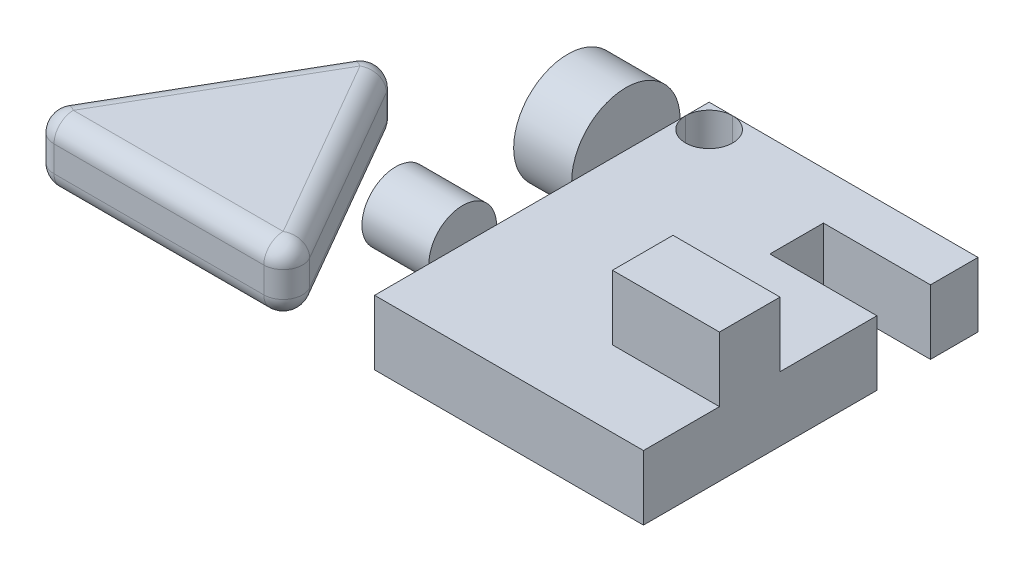
ISO-10303-21;
HEADER;
FILE_DESCRIPTION(('STEP AP214'),'2;1');
FILE_NAME('part.step','',(''),(''),'','','');
FILE_SCHEMA(('AUTOMOTIVE_DESIGN { 1 0 10303 214 1 1 1 1 }'));
ENDSEC;
DATA;
#1=APPLICATION_CONTEXT('core data for automotive mechanical design processes');
#2=APPLICATION_PROTOCOL_DEFINITION('international standard','automotive_design',2000,#1);
#3=PRODUCT_CONTEXT('',#1,'mechanical');
#4=PRODUCT('Part','Part','',(#3));
#5=PRODUCT_RELATED_PRODUCT_CATEGORY('part','',(#4));
#6=PRODUCT_DEFINITION_FORMATION('','',#4);
#7=PRODUCT_DEFINITION_CONTEXT('part definition',#1,'design');
#8=PRODUCT_DEFINITION('design','',#6,#7);
#9=PRODUCT_DEFINITION_SHAPE('','',#8);
#10=(LENGTH_UNIT() NAMED_UNIT(*) SI_UNIT(.MILLI.,.METRE.));
#11=(NAMED_UNIT(*) PLANE_ANGLE_UNIT() SI_UNIT($,.RADIAN.));
#12=(NAMED_UNIT(*) SI_UNIT($,.STERADIAN.) SOLID_ANGLE_UNIT());
#13=UNCERTAINTY_MEASURE_WITH_UNIT(LENGTH_MEASURE(1.E-05),#10,'distance_accuracy_value','');
#14=(GEOMETRIC_REPRESENTATION_CONTEXT(3) GLOBAL_UNCERTAINTY_ASSIGNED_CONTEXT((#13)) GLOBAL_UNIT_ASSIGNED_CONTEXT((#10,
#11,#12)) REPRESENTATION_CONTEXT('',''));
#15=CARTESIAN_POINT('',(0.,0.,0.));
#16=DIRECTION('',(0.,0.,1.));
#17=DIRECTION('',(1.,0.,0.));
#18=AXIS2_PLACEMENT_3D('',#15,#16,#17);
#19=CARTESIAN_POINT('',(0.,10.,0.));
#20=DIRECTION('',(0.,-1.,0.));
#21=DIRECTION('',(0.,0.,-1.));
#22=AXIS2_PLACEMENT_3D('',#19,#20,#21);
#23=PLANE('',#22);
#24=DIRECTION('',(-1.,0.,0.));
#25=VECTOR('',#24,1.);
#26=CARTESIAN_POINT('',(53.2932861145058,10.,-53.2864807231147));
#27=LINE('',#26,#25);
#28=CARTESIAN_POINT('',(94.9045117446962,10.,-53.2864807231147));
#29=VERTEX_POINT('',#28);
#30=CARTESIAN_POINT('',(56.9433094031645,10.,-53.2864807231147));
#31=VERTEX_POINT('',#30);
#32=EDGE_CURVE('E222',#29,#31,#27,.T.);
#33=ORIENTED_EDGE('',*,*,#32,.T.);
#34=CARTESIAN_POINT('',(56.9433094031645,10.,-49.636457434456));
#35=DIRECTION('',(0.,1.,0.));
#36=DIRECTION('',(0.,0.,1.));
#37=AXIS2_PLACEMENT_3D('',#34,#35,#36);
#38=CIRCLE('',#37,3.6500232886587);
#39=CARTESIAN_POINT('',(53.2932861145058,10.,-49.636457434456));
#40=VERTEX_POINT('',#39);
#41=EDGE_CURVE('E56',#40,#31,#38,.T.);
#42=ORIENTED_EDGE('',*,*,#41,.F.);
#43=DIRECTION('',(0.,0.,1.));
#44=VECTOR('',#43,1.);
#45=CARTESIAN_POINT('',(53.2932861145058,10.,-1.51599264809515));
#46=LINE('',#45,#44);
#47=CARTESIAN_POINT('',(53.2932861145058,10.,-48.7900032886893));
#48=VERTEX_POINT('',#47);
#49=EDGE_CURVE('E226',#40,#48,#46,.T.);
#50=ORIENTED_EDGE('',*,*,#49,.T.);
#51=CARTESIAN_POINT('',(53.2932861145058,10.,-32.0196260164736));
#52=VERTEX_POINT('',#51);
#53=EDGE_CURVE('E229',#48,#52,#46,.T.);
#54=ORIENTED_EDGE('',*,*,#53,.T.);
#55=CARTESIAN_POINT('',(53.2932861145058,10.,-20.3790112039944));
#56=VERTEX_POINT('',#55);
#57=EDGE_CURVE('E361',#52,#56,#46,.T.);
#58=ORIENTED_EDGE('',*,*,#57,.T.);
#59=CARTESIAN_POINT('',(53.2932861145058,10.,-9.92218772837755));
#60=VERTEX_POINT('',#59);
#61=EDGE_CURVE('E261',#56,#60,#46,.T.);
#62=ORIENTED_EDGE('',*,*,#61,.T.);
#63=CARTESIAN_POINT('',(53.2932861145058,10.,-1.51599264809515));
#64=VERTEX_POINT('',#63);
#65=EDGE_CURVE('E230',#60,#64,#46,.T.);
#66=ORIENTED_EDGE('',*,*,#65,.T.);
#67=DIRECTION('',(1.,0.,0.));
#68=VECTOR('',#67,1.);
#69=CARTESIAN_POINT('',(53.2932861145058,10.,-1.51599264809515));
#70=LINE('',#69,#68);
#71=CARTESIAN_POINT('',(94.9045117446962,10.,-1.51599264809515));
#72=VERTEX_POINT('',#71);
#73=EDGE_CURVE('E255',#64,#72,#70,.T.);
#74=ORIENTED_EDGE('',*,*,#73,.T.);
#75=DIRECTION('',(0.,0.,-1.));
#76=VECTOR('',#75,1.);
#77=CARTESIAN_POINT('',(94.9045117446962,10.,-1.51599264809515));
#78=LINE('',#77,#76);
#79=CARTESIAN_POINT('',(94.9045117446962,10.,-13.2762631828207));
#80=VERTEX_POINT('',#79);
#81=EDGE_CURVE('E246',#72,#80,#78,.T.);
#82=ORIENTED_EDGE('',*,*,#81,.T.);
#83=DIRECTION('',(1.,0.,0.));
#84=VECTOR('',#83,1.);
#85=CARTESIAN_POINT('',(0.,10.,-13.2762631828207));
#86=LINE('',#85,#84);
#87=CARTESIAN_POINT('',(78.3424140614023,10.,-13.2762631828207));
#88=VERTEX_POINT('',#87);
#89=EDGE_CURVE('E187',#88,#80,#86,.T.);
#90=ORIENTED_EDGE('',*,*,#89,.F.);
#91=DIRECTION('',(0.,0.,1.));
#92=VECTOR('',#91,1.);
#93=CARTESIAN_POINT('',(78.3424140614023,10.,0.));
#94=LINE('',#93,#92);
#95=CARTESIAN_POINT('',(78.3424140614023,10.,-22.6479445996471));
#96=VERTEX_POINT('',#95);
#97=EDGE_CURVE('E184',#96,#88,#94,.T.);
#98=ORIENTED_EDGE('',*,*,#97,.F.);
#99=DIRECTION('',(-1.,0.,0.));
#100=VECTOR('',#99,1.);
#101=CARTESIAN_POINT('',(0.,10.,-22.6479445996471));
#102=LINE('',#101,#100);
#103=CARTESIAN_POINT('',(94.9045117446962,10.,-22.6479445996471));
#104=VERTEX_POINT('',#103);
#105=EDGE_CURVE('E186',#104,#96,#102,.T.);
#106=ORIENTED_EDGE('',*,*,#105,.F.);
#107=CARTESIAN_POINT('',(94.9045117446962,10.,-37.6426348665694));
#108=VERTEX_POINT('',#107);
#109=EDGE_CURVE('E244',#104,#108,#78,.T.);
#110=ORIENTED_EDGE('',*,*,#109,.T.);
#111=DIRECTION('',(1.,0.,0.));
#112=VECTOR('',#111,1.);
#113=CARTESIAN_POINT('',(0.,10.,-37.6426348665694));
#114=LINE('',#113,#112);
#115=CARTESIAN_POINT('',(78.3424140614023,10.,-37.6426348665694));
#116=VERTEX_POINT('',#115);
#117=EDGE_CURVE('E284',#116,#108,#114,.T.);
#118=ORIENTED_EDGE('',*,*,#117,.F.);
#119=DIRECTION('',(0.,0.,1.));
#120=VECTOR('',#119,1.);
#121=CARTESIAN_POINT('',(78.3424140614023,10.,0.));
#122=LINE('',#121,#120);
#123=CARTESIAN_POINT('',(78.3424140614023,10.,-45.9291742246054));
#124=VERTEX_POINT('',#123);
#125=EDGE_CURVE('E281',#124,#116,#122,.T.);
#126=ORIENTED_EDGE('',*,*,#125,.F.);
#127=DIRECTION('',(-1.,0.,0.));
#128=VECTOR('',#127,1.);
#129=CARTESIAN_POINT('',(0.,10.,-45.9291742246054));
#130=LINE('',#129,#128);
#131=CARTESIAN_POINT('',(94.9045117446962,10.,-45.9291742246054));
#132=VERTEX_POINT('',#131);
#133=EDGE_CURVE('E292',#132,#124,#130,.T.);
#134=ORIENTED_EDGE('',*,*,#133,.F.);
#135=EDGE_CURVE('E235',#132,#29,#78,.T.);
#136=ORIENTED_EDGE('',*,*,#135,.T.);
#137=EDGE_LOOP('',(#33,#42,#50,#54,#58,#62,#66,#74,#82,#90,#98,#106,#110,#118,#126,#134,#136));
#138=FACE_BOUND('',#137,.T.);
#139=ADVANCED_FACE('F52',(#138),#23,.F.);
#140=CARTESIAN_POINT('',(53.2932861145058,10.,-1.51599264809515));
#141=DIRECTION('',(1.,0.,0.));
#142=DIRECTION('',(0.,0.,-1.));
#143=AXIS2_PLACEMENT_3D('',#140,#141,#142);
#144=PLANE('',#143);
#145=DIRECTION('',(0.,1.,0.));
#146=VECTOR('',#145,1.);
#147=CARTESIAN_POINT('',(53.2932861145058,0.,-49.636457434456));
#148=LINE('',#147,#146);
#149=CARTESIAN_POINT('',(53.2932861145058,0.,-49.636457434456));
#150=VERTEX_POINT('',#149);
#151=EDGE_CURVE('E213',#150,#40,#148,.T.);
#152=ORIENTED_EDGE('',*,*,#151,.F.);
#153=DIRECTION('',(0.,0.,1.));
#154=VECTOR('',#153,1.);
#155=CARTESIAN_POINT('',(53.2932861145058,0.,-1.51599264809515));
#156=LINE('',#155,#154);
#157=CARTESIAN_POINT('',(53.2932861145058,0.,-1.51599264809515));
#158=VERTEX_POINT('',#157);
#159=EDGE_CURVE('E232',#150,#158,#156,.T.);
#160=ORIENTED_EDGE('',*,*,#159,.T.);
#161=DIRECTION('',(0.,-1.,0.));
#162=VECTOR('',#161,1.);
#163=CARTESIAN_POINT('',(53.2932861145058,10.,-1.51599264809515));
#164=LINE('',#163,#162);
#165=EDGE_CURVE('E332',#64,#158,#164,.T.);
#166=ORIENTED_EDGE('',*,*,#165,.F.);
#167=ORIENTED_EDGE('',*,*,#65,.F.);
#168=CARTESIAN_POINT('',(53.2932861145058,10.,-15.150599466186));
#169=DIRECTION('',(-1.,0.,0.));
#170=DIRECTION('',(0.,0.,1.));
#171=AXIS2_PLACEMENT_3D('',#168,#169,#170);
#172=CIRCLE('',#171,5.22841173780843);
#173=EDGE_CURVE('E276',#56,#60,#172,.T.);
#174=ORIENTED_EDGE('',*,*,#173,.F.);
#175=ORIENTED_EDGE('',*,*,#57,.F.);
#176=CARTESIAN_POINT('',(53.2932861145058,10.,-40.4048146525814));
#177=DIRECTION('',(-1.,0.,0.));
#178=DIRECTION('',(0.,0.,1.));
#179=AXIS2_PLACEMENT_3D('',#176,#177,#178);
#180=CIRCLE('',#179,8.38518863610786);
#181=EDGE_CURVE('E267',#48,#52,#180,.T.);
#182=ORIENTED_EDGE('',*,*,#181,.F.);
#183=ORIENTED_EDGE('',*,*,#49,.F.);
#184=EDGE_LOOP('',(#152,#160,#166,#167,#174,#175,#182,#183));
#185=FACE_BOUND('',#184,.T.);
#186=ADVANCED_FACE('F360',(#185),#144,.F.);
#187=CARTESIAN_POINT('',(0.,0.,0.));
#188=DIRECTION('',(0.,-1.,0.));
#189=DIRECTION('',(0.,0.,-1.));
#190=AXIS2_PLACEMENT_3D('',#187,#188,#189);
#191=PLANE('',#190);
#192=CARTESIAN_POINT('',(56.9433094031645,0.,-49.636457434456));
#193=DIRECTION('',(0.,-1.,0.));
#194=DIRECTION('',(0.,0.,-1.));
#195=AXIS2_PLACEMENT_3D('',#192,#193,#194);
#196=CIRCLE('',#195,3.6500232886587);
#197=CARTESIAN_POINT('',(56.9433094031645,0.,-53.2864807231147));
#198=VERTEX_POINT('',#197);
#199=EDGE_CURVE('E12',#198,#150,#196,.T.);
#200=ORIENTED_EDGE('',*,*,#199,.F.);
#201=DIRECTION('',(-1.,0.,0.));
#202=VECTOR('',#201,1.);
#203=CARTESIAN_POINT('',(53.2932861145058,0.,-53.2864807231147));
#204=LINE('',#203,#202);
#205=CARTESIAN_POINT('',(94.9045117446962,0.,-53.2864807231147));
#206=VERTEX_POINT('',#205);
#207=EDGE_CURVE('E219',#206,#198,#204,.T.);
#208=ORIENTED_EDGE('',*,*,#207,.F.);
#209=DIRECTION('',(0.,0.,-1.));
#210=VECTOR('',#209,1.);
#211=CARTESIAN_POINT('',(94.9045117446962,0.,-1.51599264809515));
#212=LINE('',#211,#210);
#213=CARTESIAN_POINT('',(94.9045117446962,0.,-45.9291742246054));
#214=VERTEX_POINT('',#213);
#215=EDGE_CURVE('E307',#214,#206,#212,.T.);
#216=ORIENTED_EDGE('',*,*,#215,.F.);
#217=DIRECTION('',(-1.,0.,0.));
#218=VECTOR('',#217,1.);
#219=CARTESIAN_POINT('',(0.,0.,-45.9291742246054));
#220=LINE('',#219,#218);
#221=CARTESIAN_POINT('',(78.3424140614023,0.,-45.9291742246054));
#222=VERTEX_POINT('',#221);
#223=EDGE_CURVE('E234',#214,#222,#220,.T.);
#224=ORIENTED_EDGE('',*,*,#223,.T.);
#225=DIRECTION('',(0.,0.,1.));
#226=VECTOR('',#225,1.);
#227=CARTESIAN_POINT('',(78.3424140614023,0.,0.));
#228=LINE('',#227,#226);
#229=CARTESIAN_POINT('',(78.3424140614023,0.,-37.6426348665694));
#230=VERTEX_POINT('',#229);
#231=EDGE_CURVE('E197',#222,#230,#228,.T.);
#232=ORIENTED_EDGE('',*,*,#231,.T.);
#233=DIRECTION('',(1.,0.,0.));
#234=VECTOR('',#233,1.);
#235=CARTESIAN_POINT('',(0.,0.,-37.6426348665694));
#236=LINE('',#235,#234);
#237=CARTESIAN_POINT('',(94.9045117446962,0.,-37.6426348665694));
#238=VERTEX_POINT('',#237);
#239=EDGE_CURVE('E304',#230,#238,#236,.T.);
#240=ORIENTED_EDGE('',*,*,#239,.T.);
#241=CARTESIAN_POINT('',(94.9045117446962,0.,-1.51599264809515));
#242=VERTEX_POINT('',#241);
#243=EDGE_CURVE('E288',#242,#238,#212,.T.);
#244=ORIENTED_EDGE('',*,*,#243,.F.);
#245=DIRECTION('',(1.,0.,0.));
#246=VECTOR('',#245,1.);
#247=CARTESIAN_POINT('',(53.2932861145058,0.,-1.51599264809515));
#248=LINE('',#247,#246);
#249=EDGE_CURVE('E315',#158,#242,#248,.T.);
#250=ORIENTED_EDGE('',*,*,#249,.F.);
#251=ORIENTED_EDGE('',*,*,#159,.F.);
#252=EDGE_LOOP('',(#200,#208,#216,#224,#232,#240,#244,#250,#251));
#253=FACE_BOUND('',#252,.T.);
#254=ADVANCED_FACE('F318',(#253),#191,.T.);
#255=CARTESIAN_POINT('',(94.9045117446962,10.,-1.51599264809515));
#256=DIRECTION('',(-1.,0.,0.));
#257=DIRECTION('',(0.,0.,1.));
#258=AXIS2_PLACEMENT_3D('',#255,#256,#257);
#259=PLANE('',#258);
#260=ORIENTED_EDGE('',*,*,#135,.F.);
#261=DIRECTION('',(0.,1.,0.));
#262=VECTOR('',#261,1.);
#263=CARTESIAN_POINT('',(94.9045117446962,0.,-45.9291742246054));
#264=LINE('',#263,#262);
#265=EDGE_CURVE('E289',#214,#132,#264,.T.);
#266=ORIENTED_EDGE('',*,*,#265,.F.);
#267=ORIENTED_EDGE('',*,*,#215,.T.);
#268=DIRECTION('',(0.,-1.,0.));
#269=VECTOR('',#268,1.);
#270=CARTESIAN_POINT('',(94.9045117446962,10.,-53.2864807231147));
#271=LINE('',#270,#269);
#272=EDGE_CURVE('E218',#29,#206,#271,.T.);
#273=ORIENTED_EDGE('',*,*,#272,.F.);
#274=EDGE_LOOP('',(#260,#266,#267,#273));
#275=FACE_BOUND('',#274,.T.);
#276=ADVANCED_FACE('F394',(#275),#259,.F.);
#277=CARTESIAN_POINT('',(53.2932861145058,10.,-1.51599264809515));
#278=DIRECTION('',(0.,0.,-1.));
#279=DIRECTION('',(-1.,0.,0.));
#280=AXIS2_PLACEMENT_3D('',#277,#278,#279);
#281=PLANE('',#280);
#282=ORIENTED_EDGE('',*,*,#249,.T.);
#283=DIRECTION('',(0.,-1.,0.));
#284=VECTOR('',#283,1.);
#285=CARTESIAN_POINT('',(94.9045117446962,10.,-1.51599264809515));
#286=LINE('',#285,#284);
#287=EDGE_CURVE('E201',#72,#242,#286,.T.);
#288=ORIENTED_EDGE('',*,*,#287,.F.);
#289=ORIENTED_EDGE('',*,*,#73,.F.);
#290=ORIENTED_EDGE('',*,*,#165,.T.);
#291=EDGE_LOOP('',(#282,#288,#289,#290));
#292=FACE_BOUND('',#291,.T.);
#293=ADVANCED_FACE('F340',(#292),#281,.F.);
#294=ORIENTED_EDGE('',*,*,#243,.T.);
#295=DIRECTION('',(0.,1.,0.));
#296=VECTOR('',#295,1.);
#297=CARTESIAN_POINT('',(94.9045117446962,0.,-37.6426348665694));
#298=LINE('',#297,#296);
#299=EDGE_CURVE('E202',#238,#108,#298,.T.);
#300=ORIENTED_EDGE('',*,*,#299,.T.);
#301=ORIENTED_EDGE('',*,*,#109,.F.);
#302=DIRECTION('',(0.,-1.,0.));
#303=VECTOR('',#302,1.);
#304=CARTESIAN_POINT('',(94.9045117446962,20.,-22.6479445996471));
#305=LINE('',#304,#303);
#306=CARTESIAN_POINT('',(94.9045117446962,20.,-22.6479445996471));
#307=VERTEX_POINT('',#306);
#308=EDGE_CURVE('E181',#307,#104,#305,.T.);
#309=ORIENTED_EDGE('',*,*,#308,.F.);
#310=DIRECTION('',(0.,0.,-1.));
#311=VECTOR('',#310,1.);
#312=CARTESIAN_POINT('',(94.9045117446962,20.,0.));
#313=LINE('',#312,#311);
#314=CARTESIAN_POINT('',(94.9045117446962,20.,-13.2762631828207));
#315=VERTEX_POINT('',#314);
#316=EDGE_CURVE('E170',#315,#307,#313,.T.);
#317=ORIENTED_EDGE('',*,*,#316,.F.);
#318=DIRECTION('',(0.,-1.,0.));
#319=VECTOR('',#318,1.);
#320=CARTESIAN_POINT('',(94.9045117446962,20.,-13.2762631828207));
#321=LINE('',#320,#319);
#322=EDGE_CURVE('E166',#315,#80,#321,.T.);
#323=ORIENTED_EDGE('',*,*,#322,.T.);
#324=ORIENTED_EDGE('',*,*,#81,.F.);
#325=ORIENTED_EDGE('',*,*,#287,.T.);
#326=EDGE_LOOP('',(#294,#300,#301,#309,#317,#323,#324,#325));
#327=FACE_BOUND('',#326,.T.);
#328=ADVANCED_FACE('F328',(#327),#259,.F.);
#329=CARTESIAN_POINT('',(53.2932861145058,10.,-53.2864807231147));
#330=DIRECTION('',(0.,0.,1.));
#331=DIRECTION('',(1.,0.,0.));
#332=AXIS2_PLACEMENT_3D('',#329,#330,#331);
#333=PLANE('',#332);
#334=ORIENTED_EDGE('',*,*,#207,.T.);
#335=DIRECTION('',(0.,1.,0.));
#336=VECTOR('',#335,1.);
#337=CARTESIAN_POINT('',(56.9433094031645,0.,-53.2864807231147));
#338=LINE('',#337,#336);
#339=EDGE_CURVE('E73',#198,#31,#338,.T.);
#340=ORIENTED_EDGE('',*,*,#339,.T.);
#341=ORIENTED_EDGE('',*,*,#32,.F.);
#342=ORIENTED_EDGE('',*,*,#272,.T.);
#343=EDGE_LOOP('',(#334,#340,#341,#342));
#344=FACE_BOUND('',#343,.T.);
#345=ADVANCED_FACE('F344',(#344),#333,.F.);
#346=CARTESIAN_POINT('',(53.2932861145058,10.,-48.7900032886893));
#347=DIRECTION('',(-1.,0.,0.));
#348=DIRECTION('',(0.,0.,1.));
#349=AXIS2_PLACEMENT_3D('',#346,#347,#348);
#350=PLANE('',#349);
#351=ORIENTED_EDGE('',*,*,#53,.F.);
#352=EDGE_CURVE('E263',#52,#48,#180,.T.);
#353=ORIENTED_EDGE('',*,*,#352,.F.);
#354=EDGE_LOOP('',(#351,#353));
#355=FACE_BOUND('',#354,.T.);
#356=ADVANCED_FACE('F374',(#355),#350,.F.);
#357=CARTESIAN_POINT('',(44.3084131266116,10.,-40.4048146525814));
#358=DIRECTION('',(-1.,0.,0.));
#359=DIRECTION('',(0.,0.,1.));
#360=AXIS2_PLACEMENT_3D('',#357,#358,#359);
#361=CYLINDRICAL_SURFACE('',#360,8.38518863610786);
#362=CARTESIAN_POINT('',(44.3084131266116,10.,-40.4048146525814));
#363=DIRECTION('',(-1.,0.,0.));
#364=DIRECTION('',(0.,0.,1.));
#365=AXIS2_PLACEMENT_3D('',#362,#363,#364);
#366=CIRCLE('',#365,8.38518863610786);
#367=CARTESIAN_POINT('',(44.3084131266116,10.,-32.0196260164736));
#368=VERTEX_POINT('',#367);
#369=EDGE_CURVE('E268',#368,#368,#366,.T.);
#370=ORIENTED_EDGE('',*,*,#369,.F.);
#371=EDGE_LOOP('',(#370));
#372=FACE_BOUND('',#371,.T.);
#373=ORIENTED_EDGE('',*,*,#352,.T.);
#374=ORIENTED_EDGE('',*,*,#181,.T.);
#375=EDGE_LOOP('',(#373,#374));
#376=FACE_BOUND('',#375,.T.);
#377=ADVANCED_FACE('F373',(#372,#376),#361,.T.);
#378=CARTESIAN_POINT('',(44.3084131266116,10.,-48.7900032886893));
#379=DIRECTION('',(1.,0.,0.));
#380=DIRECTION('',(0.,0.,-1.));
#381=AXIS2_PLACEMENT_3D('',#378,#379,#380);
#382=PLANE('',#381);
#383=ORIENTED_EDGE('',*,*,#369,.T.);
#384=EDGE_LOOP('',(#383));
#385=FACE_BOUND('',#384,.T.);
#386=ADVANCED_FACE('F381',(#385),#382,.F.);
#387=CARTESIAN_POINT('',(53.2932861145058,10.,-15.150599466186));
#388=DIRECTION('',(-1.,0.,0.));
#389=DIRECTION('',(0.,0.,1.));
#390=AXIS2_PLACEMENT_3D('',#387,#388,#389);
#391=PLANE('',#390);
#392=EDGE_CURVE('E272',#60,#56,#172,.T.);
#393=ORIENTED_EDGE('',*,*,#392,.F.);
#394=ORIENTED_EDGE('',*,*,#61,.F.);
#395=EDGE_LOOP('',(#393,#394));
#396=FACE_BOUND('',#395,.T.);
#397=ADVANCED_FACE('F419',(#396),#391,.F.);
#398=CARTESIAN_POINT('',(42.9273232336056,10.,-15.150599466186));
#399=DIRECTION('',(-1.,0.,0.));
#400=DIRECTION('',(0.,0.,1.));
#401=AXIS2_PLACEMENT_3D('',#398,#399,#400);
#402=CYLINDRICAL_SURFACE('',#401,5.22841173780843);
#403=CARTESIAN_POINT('',(42.9273232336056,10.,-15.150599466186));
#404=DIRECTION('',(-1.,0.,0.));
#405=DIRECTION('',(0.,0.,1.));
#406=AXIS2_PLACEMENT_3D('',#403,#404,#405);
#407=CIRCLE('',#406,5.22841173780843);
#408=CARTESIAN_POINT('',(42.9273232336056,10.,-9.92218772837755));
#409=VERTEX_POINT('',#408);
#410=EDGE_CURVE('E277',#409,#409,#407,.T.);
#411=ORIENTED_EDGE('',*,*,#410,.F.);
#412=EDGE_LOOP('',(#411));
#413=FACE_BOUND('',#412,.T.);
#414=ORIENTED_EDGE('',*,*,#392,.T.);
#415=ORIENTED_EDGE('',*,*,#173,.T.);
#416=EDGE_LOOP('',(#414,#415));
#417=FACE_BOUND('',#416,.T.);
#418=ADVANCED_FACE('F356',(#413,#417),#402,.T.);
#419=CARTESIAN_POINT('',(42.9273232336056,10.,-20.3790112039944));
#420=DIRECTION('',(1.,0.,0.));
#421=DIRECTION('',(0.,0.,-1.));
#422=AXIS2_PLACEMENT_3D('',#419,#420,#421);
#423=PLANE('',#422);
#424=ORIENTED_EDGE('',*,*,#410,.T.);
#425=EDGE_LOOP('',(#424));
#426=FACE_BOUND('',#425,.T.);
#427=ADVANCED_FACE('F413',(#426),#423,.F.);
#428=CARTESIAN_POINT('',(78.3424140614023,0.,0.));
#429=DIRECTION('',(-1.,0.,0.));
#430=DIRECTION('',(0.,0.,1.));
#431=AXIS2_PLACEMENT_3D('',#428,#429,#430);
#432=PLANE('',#431);
#433=ORIENTED_EDGE('',*,*,#125,.T.);
#434=DIRECTION('',(0.,1.,0.));
#435=VECTOR('',#434,1.);
#436=CARTESIAN_POINT('',(78.3424140614023,0.,-37.6426348665694));
#437=LINE('',#436,#435);
#438=EDGE_CURVE('E210',#230,#116,#437,.T.);
#439=ORIENTED_EDGE('',*,*,#438,.F.);
#440=ORIENTED_EDGE('',*,*,#231,.F.);
#441=DIRECTION('',(0.,1.,0.));
#442=VECTOR('',#441,1.);
#443=CARTESIAN_POINT('',(78.3424140614023,0.,-45.9291742246054));
#444=LINE('',#443,#442);
#445=EDGE_CURVE('E293',#222,#124,#444,.T.);
#446=ORIENTED_EDGE('',*,*,#445,.T.);
#447=EDGE_LOOP('',(#433,#439,#440,#446));
#448=FACE_BOUND('',#447,.T.);
#449=ADVANCED_FACE('F321',(#448),#432,.F.);
#450=CARTESIAN_POINT('',(0.,0.,-45.9291742246054));
#451=DIRECTION('',(0.,0.,-1.));
#452=DIRECTION('',(-1.,0.,0.));
#453=AXIS2_PLACEMENT_3D('',#450,#451,#452);
#454=PLANE('',#453);
#455=ORIENTED_EDGE('',*,*,#133,.T.);
#456=ORIENTED_EDGE('',*,*,#445,.F.);
#457=ORIENTED_EDGE('',*,*,#223,.F.);
#458=ORIENTED_EDGE('',*,*,#265,.T.);
#459=EDGE_LOOP('',(#455,#456,#457,#458));
#460=FACE_BOUND('',#459,.T.);
#461=ADVANCED_FACE('F405',(#460),#454,.F.);
#462=CARTESIAN_POINT('',(0.,0.,-37.6426348665694));
#463=DIRECTION('',(0.,0.,1.));
#464=DIRECTION('',(1.,0.,0.));
#465=AXIS2_PLACEMENT_3D('',#462,#463,#464);
#466=PLANE('',#465);
#467=ORIENTED_EDGE('',*,*,#117,.T.);
#468=ORIENTED_EDGE('',*,*,#299,.F.);
#469=ORIENTED_EDGE('',*,*,#239,.F.);
#470=ORIENTED_EDGE('',*,*,#438,.T.);
#471=EDGE_LOOP('',(#467,#468,#469,#470));
#472=FACE_BOUND('',#471,.T.);
#473=ADVANCED_FACE('F325',(#472),#466,.F.);
#474=CARTESIAN_POINT('',(78.3424140614023,20.,0.));
#475=DIRECTION('',(1.,0.,0.));
#476=DIRECTION('',(0.,0.,-1.));
#477=AXIS2_PLACEMENT_3D('',#474,#475,#476);
#478=PLANE('',#477);
#479=ORIENTED_EDGE('',*,*,#97,.T.);
#480=DIRECTION('',(0.,-1.,0.));
#481=VECTOR('',#480,1.);
#482=CARTESIAN_POINT('',(78.3424140614023,20.,-13.2762631828207));
#483=LINE('',#482,#481);
#484=CARTESIAN_POINT('',(78.3424140614023,20.,-13.2762631828207));
#485=VERTEX_POINT('',#484);
#486=EDGE_CURVE('E163',#485,#88,#483,.T.);
#487=ORIENTED_EDGE('',*,*,#486,.F.);
#488=DIRECTION('',(0.,0.,1.));
#489=VECTOR('',#488,1.);
#490=CARTESIAN_POINT('',(78.3424140614023,20.,0.));
#491=LINE('',#490,#489);
#492=CARTESIAN_POINT('',(78.3424140614023,20.,-22.6479445996471));
#493=VERTEX_POINT('',#492);
#494=EDGE_CURVE('E171',#493,#485,#491,.T.);
#495=ORIENTED_EDGE('',*,*,#494,.F.);
#496=DIRECTION('',(0.,-1.,0.));
#497=VECTOR('',#496,1.);
#498=CARTESIAN_POINT('',(78.3424140614023,20.,-22.6479445996471));
#499=LINE('',#498,#497);
#500=EDGE_CURVE('E193',#493,#96,#499,.T.);
#501=ORIENTED_EDGE('',*,*,#500,.T.);
#502=EDGE_LOOP('',(#479,#487,#495,#501));
#503=FACE_BOUND('',#502,.T.);
#504=ADVANCED_FACE('F183',(#503),#478,.F.);
#505=CARTESIAN_POINT('',(0.,20.,-13.2762631828207));
#506=DIRECTION('',(0.,0.,-1.));
#507=DIRECTION('',(-1.,0.,0.));
#508=AXIS2_PLACEMENT_3D('',#505,#506,#507);
#509=PLANE('',#508);
#510=ORIENTED_EDGE('',*,*,#89,.T.);
#511=ORIENTED_EDGE('',*,*,#322,.F.);
#512=DIRECTION('',(1.,0.,0.));
#513=VECTOR('',#512,1.);
#514=CARTESIAN_POINT('',(0.,20.,-13.2762631828207));
#515=LINE('',#514,#513);
#516=EDGE_CURVE('E158',#485,#315,#515,.T.);
#517=ORIENTED_EDGE('',*,*,#516,.F.);
#518=ORIENTED_EDGE('',*,*,#486,.T.);
#519=EDGE_LOOP('',(#510,#511,#517,#518));
#520=FACE_BOUND('',#519,.T.);
#521=ADVANCED_FACE('F161',(#520),#509,.F.);
#522=CARTESIAN_POINT('',(0.,20.,-22.6479445996471));
#523=DIRECTION('',(0.,0.,1.));
#524=DIRECTION('',(1.,0.,0.));
#525=AXIS2_PLACEMENT_3D('',#522,#523,#524);
#526=PLANE('',#525);
#527=ORIENTED_EDGE('',*,*,#105,.T.);
#528=ORIENTED_EDGE('',*,*,#500,.F.);
#529=DIRECTION('',(-1.,0.,0.));
#530=VECTOR('',#529,1.);
#531=CARTESIAN_POINT('',(0.,20.,-22.6479445996471));
#532=LINE('',#531,#530);
#533=EDGE_CURVE('E176',#307,#493,#532,.T.);
#534=ORIENTED_EDGE('',*,*,#533,.F.);
#535=ORIENTED_EDGE('',*,*,#308,.T.);
#536=EDGE_LOOP('',(#527,#528,#534,#535));
#537=FACE_BOUND('',#536,.T.);
#538=ADVANCED_FACE('F397',(#537),#526,.F.);
#539=CARTESIAN_POINT('',(0.,20.,0.));
#540=DIRECTION('',(0.,1.,0.));
#541=DIRECTION('',(0.,0.,1.));
#542=AXIS2_PLACEMENT_3D('',#539,#540,#541);
#543=PLANE('',#542);
#544=ORIENTED_EDGE('',*,*,#494,.T.);
#545=ORIENTED_EDGE('',*,*,#516,.T.);
#546=ORIENTED_EDGE('',*,*,#316,.T.);
#547=ORIENTED_EDGE('',*,*,#533,.T.);
#548=EDGE_LOOP('',(#544,#545,#546,#547));
#549=FACE_BOUND('',#548,.T.);
#550=ADVANCED_FACE('F174',(#549),#543,.T.);
#551=CARTESIAN_POINT('',(56.9433094031645,0.,-49.636457434456));
#552=DIRECTION('',(0.,1.,0.));
#553=DIRECTION('',(0.,0.,1.));
#554=AXIS2_PLACEMENT_3D('',#551,#552,#553);
#555=CYLINDRICAL_SURFACE('',#554,3.6500232886587);
#556=ORIENTED_EDGE('',*,*,#151,.T.);
#557=ORIENTED_EDGE('',*,*,#41,.T.);
#558=ORIENTED_EDGE('',*,*,#339,.F.);
#559=ORIENTED_EDGE('',*,*,#199,.T.);
#560=EDGE_LOOP('',(#556,#557,#558,#559));
#561=FACE_BOUND('',#560,.T.);
#562=ADVANCED_FACE('F54',(#561),#555,.F.);
#563=CLOSED_SHELL('',(#139,#186,#254,#276,#293,#328,#345,#356,#377,#386,#397,#418,#427,#449,
#461,#473,#504,#521,#538,#550,#562));
#564=MANIFOLD_SOLID_BREP('B2',#563);
#565=CARTESIAN_POINT('',(0.,0.,0.));
#566=DIRECTION('',(0.,-1.,0.));
#567=DIRECTION('',(0.,0.,-1.));
#568=AXIS2_PLACEMENT_3D('',#565,#566,#567);
#569=PLANE('',#568);
#570=CARTESIAN_POINT('',(56.9433094031645,0.,-49.636457434456));
#571=DIRECTION('',(0.,1.,0.));
#572=DIRECTION('',(0.,0.,1.));
#573=AXIS2_PLACEMENT_3D('',#570,#571,#572);
#574=CIRCLE('',#573,3.6500232886587);
#575=CARTESIAN_POINT('',(56.9433094031645,0.,-53.2864807231147));
#576=VERTEX_POINT('',#575);
#577=CARTESIAN_POINT('',(53.2932861145058,0.,-49.636457434456));
#578=VERTEX_POINT('',#577);
#579=EDGE_CURVE('E605',#576,#578,#574,.T.);
#580=ORIENTED_EDGE('',*,*,#579,.T.);
#581=DIRECTION('',(0.,0.,1.));
#582=VECTOR('',#581,1.);
#583=CARTESIAN_POINT('',(53.2932861145058,0.,-1.51599264809515));
#584=LINE('',#583,#582);
#585=CARTESIAN_POINT('',(53.2932861145058,0.,-53.2864807231147));
#586=VERTEX_POINT('',#585);
#587=EDGE_CURVE('E610',#586,#578,#584,.T.);
#588=ORIENTED_EDGE('',*,*,#587,.F.);
#589=DIRECTION('',(-1.,0.,0.));
#590=VECTOR('',#589,1.);
#591=CARTESIAN_POINT('',(53.2932861145058,0.,-53.2864807231147));
#592=LINE('',#591,#590);
#593=EDGE_CURVE('E616',#576,#586,#592,.T.);
#594=ORIENTED_EDGE('',*,*,#593,.F.);
#595=EDGE_LOOP('',(#580,#588,#594));
#596=FACE_BOUND('',#595,.T.);
#597=ADVANCED_FACE('F574',(#596),#569,.T.);
#598=CARTESIAN_POINT('',(53.2932861145058,10.,-53.2864807231147));
#599=DIRECTION('',(0.,0.,1.));
#600=DIRECTION('',(1.,0.,0.));
#601=AXIS2_PLACEMENT_3D('',#598,#599,#600);
#602=PLANE('',#601);
#603=DIRECTION('',(0.,1.,0.));
#604=VECTOR('',#603,1.);
#605=CARTESIAN_POINT('',(56.9433094031645,0.,-53.2864807231147));
#606=LINE('',#605,#604);
#607=CARTESIAN_POINT('',(56.9433094031645,10.,-53.2864807231147));
#608=VERTEX_POINT('',#607);
#609=EDGE_CURVE('E50',#576,#608,#606,.T.);
#610=ORIENTED_EDGE('',*,*,#609,.F.);
#611=ORIENTED_EDGE('',*,*,#593,.T.);
#612=DIRECTION('',(0.,-1.,0.));
#613=VECTOR('',#612,1.);
#614=CARTESIAN_POINT('',(53.2932861145058,10.,-53.2864807231147));
#615=LINE('',#614,#613);
#616=CARTESIAN_POINT('',(53.2932861145058,10.,-53.2864807231147));
#617=VERTEX_POINT('',#616);
#618=EDGE_CURVE('E578',#617,#586,#615,.T.);
#619=ORIENTED_EDGE('',*,*,#618,.F.);
#620=DIRECTION('',(-1.,0.,0.));
#621=VECTOR('',#620,1.);
#622=CARTESIAN_POINT('',(53.2932861145058,10.,-53.2864807231147));
#623=LINE('',#622,#621);
#624=EDGE_CURVE('E618',#608,#617,#623,.T.);
#625=ORIENTED_EDGE('',*,*,#624,.F.);
#626=EDGE_LOOP('',(#610,#611,#619,#625));
#627=FACE_BOUND('',#626,.T.);
#628=ADVANCED_FACE('F614',(#627),#602,.F.);
#629=CARTESIAN_POINT('',(53.2932861145058,10.,-1.51599264809515));
#630=DIRECTION('',(1.,0.,0.));
#631=DIRECTION('',(0.,0.,-1.));
#632=AXIS2_PLACEMENT_3D('',#629,#630,#631);
#633=PLANE('',#632);
#634=ORIENTED_EDGE('',*,*,#587,.T.);
#635=DIRECTION('',(0.,1.,0.));
#636=VECTOR('',#635,1.);
#637=CARTESIAN_POINT('',(53.2932861145058,0.,-49.636457434456));
#638=LINE('',#637,#636);
#639=CARTESIAN_POINT('',(53.2932861145058,10.,-49.636457434456));
#640=VERTEX_POINT('',#639);
#641=EDGE_CURVE('E583',#578,#640,#638,.T.);
#642=ORIENTED_EDGE('',*,*,#641,.T.);
#643=DIRECTION('',(0.,0.,1.));
#644=VECTOR('',#643,1.);
#645=CARTESIAN_POINT('',(53.2932861145058,10.,-1.51599264809515));
#646=LINE('',#645,#644);
#647=EDGE_CURVE('E620',#617,#640,#646,.T.);
#648=ORIENTED_EDGE('',*,*,#647,.F.);
#649=ORIENTED_EDGE('',*,*,#618,.T.);
#650=EDGE_LOOP('',(#634,#642,#648,#649));
#651=FACE_BOUND('',#650,.T.);
#652=ADVANCED_FACE('F576',(#651),#633,.F.);
#653=CARTESIAN_POINT('',(0.,10.,0.));
#654=DIRECTION('',(0.,-1.,0.));
#655=DIRECTION('',(0.,0.,-1.));
#656=AXIS2_PLACEMENT_3D('',#653,#654,#655);
#657=PLANE('',#656);
#658=ORIENTED_EDGE('',*,*,#647,.T.);
#659=CARTESIAN_POINT('',(56.9433094031645,10.,-49.636457434456));
#660=DIRECTION('',(0.,1.,0.));
#661=DIRECTION('',(0.,0.,1.));
#662=AXIS2_PLACEMENT_3D('',#659,#660,#661);
#663=CIRCLE('',#662,3.6500232886587);
#664=EDGE_CURVE('E611',#608,#640,#663,.T.);
#665=ORIENTED_EDGE('',*,*,#664,.F.);
#666=ORIENTED_EDGE('',*,*,#624,.T.);
#667=EDGE_LOOP('',(#658,#665,#666));
#668=FACE_BOUND('',#667,.T.);
#669=ADVANCED_FACE('F630',(#668),#657,.F.);
#670=CARTESIAN_POINT('',(56.9433094031645,0.,-49.636457434456));
#671=DIRECTION('',(0.,1.,0.));
#672=DIRECTION('',(0.,0.,1.));
#673=AXIS2_PLACEMENT_3D('',#670,#671,#672);
#674=CYLINDRICAL_SURFACE('',#673,3.6500232886587);
#675=ORIENTED_EDGE('',*,*,#579,.F.);
#676=ORIENTED_EDGE('',*,*,#609,.T.);
#677=ORIENTED_EDGE('',*,*,#664,.T.);
#678=ORIENTED_EDGE('',*,*,#641,.F.);
#679=EDGE_LOOP('',(#675,#676,#677,#678));
#680=FACE_BOUND('',#679,.T.);
#681=ADVANCED_FACE('F606',(#680),#674,.F.);
#682=CLOSED_SHELL('',(#597,#628,#652,#669,#681));
#683=MANIFOLD_SOLID_BREP('B6',#682);
#684=CARTESIAN_POINT('',(21.4301247578771,10.,-37.1180648931829));
#685=DIRECTION('',(0.866025403784439,0.,0.5));
#686=DIRECTION('',(0.5,0.,-0.866025403784439));
#687=AXIS2_PLACEMENT_3D('',#684,#685,#686);
#688=PLANE('',#687);
#689=DIRECTION('',(-0.5,0.,0.866025403784439));
#690=VECTOR('',#689,1.);
#691=CARTESIAN_POINT('',(21.4301247578771,3.,-37.1180648931829));
#692=LINE('',#691,#690);
#693=CARTESIAN_POINT('',(18.8320485465238,3.,-32.6180648931829));
#694=VERTEX_POINT('',#693);
#695=CARTESIAN_POINT('',(2.59807621135332,3.,-4.5));
#696=VERTEX_POINT('',#695);
#697=EDGE_CURVE('E797',#694,#696,#692,.T.);
#698=ORIENTED_EDGE('',*,*,#697,.T.);
#699=DIRECTION('',(0.,-1.,0.));
#700=VECTOR('',#699,1.);
#701=CARTESIAN_POINT('',(2.59807621135331,10.,-4.5));
#702=LINE('',#701,#700);
#703=CARTESIAN_POINT('',(2.59807621135332,7.,-4.5));
#704=VERTEX_POINT('',#703);
#705=EDGE_CURVE('E800',#696,#704,#702,.F.);
#706=ORIENTED_EDGE('',*,*,#705,.T.);
#707=DIRECTION('',(-0.5,0.,0.866025403784439));
#708=VECTOR('',#707,1.);
#709=CARTESIAN_POINT('',(21.4301247578771,7.,-37.1180648931829));
#710=LINE('',#709,#708);
#711=CARTESIAN_POINT('',(18.8320485465238,7.,-32.6180648931829));
#712=VERTEX_POINT('',#711);
#713=EDGE_CURVE('E795',#704,#712,#710,.F.);
#714=ORIENTED_EDGE('',*,*,#713,.T.);
#715=DIRECTION('',(0.,-1.,0.));
#716=VECTOR('',#715,1.);
#717=CARTESIAN_POINT('',(18.8320485465238,10.,-32.6180648931829));
#718=LINE('',#717,#716);
#719=EDGE_CURVE('E793',#712,#694,#718,.T.);
#720=ORIENTED_EDGE('',*,*,#719,.T.);
#721=EDGE_LOOP('',(#698,#706,#714,#720));
#722=FACE_BOUND('',#721,.T.);
#723=ADVANCED_FACE('F671',(#722),#688,.F.);
#724=CARTESIAN_POINT('',(0.,10.,0.));
#725=DIRECTION('',(0.,0.,-1.));
#726=DIRECTION('',(-1.,0.,0.));
#727=AXIS2_PLACEMENT_3D('',#724,#725,#726);
#728=PLANE('',#727);
#729=DIRECTION('',(1.,0.,0.));
#730=VECTOR('',#729,1.);
#731=CARTESIAN_POINT('',(0.,7.,0.));
#732=LINE('',#731,#730);
#733=CARTESIAN_POINT('',(37.6640970930476,7.,0.));
#734=VERTEX_POINT('',#733);
#735=CARTESIAN_POINT('',(5.19615242270663,7.,0.));
#736=VERTEX_POINT('',#735);
#737=EDGE_CURVE('E769',#734,#736,#732,.F.);
#738=ORIENTED_EDGE('',*,*,#737,.T.);
#739=DIRECTION('',(0.,-1.,0.));
#740=VECTOR('',#739,1.);
#741=CARTESIAN_POINT('',(5.19615242270663,10.,0.));
#742=LINE('',#741,#740);
#743=CARTESIAN_POINT('',(5.19615242270663,3.,0.));
#744=VERTEX_POINT('',#743);
#745=EDGE_CURVE('E773',#736,#744,#742,.T.);
#746=ORIENTED_EDGE('',*,*,#745,.T.);
#747=DIRECTION('',(1.,0.,0.));
#748=VECTOR('',#747,1.);
#749=CARTESIAN_POINT('',(0.,3.,0.));
#750=LINE('',#749,#748);
#751=CARTESIAN_POINT('',(37.6640970930476,3.,0.));
#752=VERTEX_POINT('',#751);
#753=EDGE_CURVE('E745',#744,#752,#750,.T.);
#754=ORIENTED_EDGE('',*,*,#753,.T.);
#755=DIRECTION('',(0.,-1.,0.));
#756=VECTOR('',#755,1.);
#757=CARTESIAN_POINT('',(37.6640970930476,10.,0.));
#758=LINE('',#757,#756);
#759=EDGE_CURVE('E763',#752,#734,#758,.F.);
#760=ORIENTED_EDGE('',*,*,#759,.T.);
#761=EDGE_LOOP('',(#738,#746,#754,#760));
#762=FACE_BOUND('',#761,.T.);
#763=ADVANCED_FACE('F771',(#762),#728,.F.);
#764=CARTESIAN_POINT('',(42.8602495157543,10.,0.));
#765=DIRECTION('',(-0.866025403784439,0.,0.5));
#766=DIRECTION('',(0.5,0.,0.866025403784439));
#767=AXIS2_PLACEMENT_3D('',#764,#765,#766);
#768=PLANE('',#767);
#769=DIRECTION('',(-0.5,0.,-0.866025403784439));
#770=VECTOR('',#769,1.);
#771=CARTESIAN_POINT('',(42.8602495157543,7.,0.));
#772=LINE('',#771,#770);
#773=CARTESIAN_POINT('',(24.0282009692304,7.,-32.6180648931829));
#774=VERTEX_POINT('',#773);
#775=CARTESIAN_POINT('',(40.2621733044009,7.,-4.5));
#776=VERTEX_POINT('',#775);
#777=EDGE_CURVE('E786',#774,#776,#772,.F.);
#778=ORIENTED_EDGE('',*,*,#777,.T.);
#779=DIRECTION('',(0.,-1.,0.));
#780=VECTOR('',#779,1.);
#781=CARTESIAN_POINT('',(40.2621733044009,10.,-4.5));
#782=LINE('',#781,#780);
#783=CARTESIAN_POINT('',(40.2621733044009,3.,-4.5));
#784=VERTEX_POINT('',#783);
#785=EDGE_CURVE('E791',#776,#784,#782,.T.);
#786=ORIENTED_EDGE('',*,*,#785,.T.);
#787=DIRECTION('',(-0.5,0.,-0.866025403784439));
#788=VECTOR('',#787,1.);
#789=CARTESIAN_POINT('',(42.8602495157543,3.,0.));
#790=LINE('',#789,#788);
#791=CARTESIAN_POINT('',(24.0282009692304,3.,-32.6180648931829));
#792=VERTEX_POINT('',#791);
#793=EDGE_CURVE('E788',#784,#792,#790,.T.);
#794=ORIENTED_EDGE('',*,*,#793,.T.);
#795=DIRECTION('',(0.,-1.,0.));
#796=VECTOR('',#795,1.);
#797=CARTESIAN_POINT('',(24.0282009692304,10.,-32.6180648931829));
#798=LINE('',#797,#796);
#799=EDGE_CURVE('E784',#792,#774,#798,.F.);
#800=ORIENTED_EDGE('',*,*,#799,.T.);
#801=EDGE_LOOP('',(#778,#786,#794,#800));
#802=FACE_BOUND('',#801,.T.);
#803=ADVANCED_FACE('F875',(#802),#768,.F.);
#804=CARTESIAN_POINT('',(0.,10.,0.));
#805=DIRECTION('',(0.,1.,0.));
#806=DIRECTION('',(0.,0.,1.));
#807=AXIS2_PLACEMENT_3D('',#804,#805,#806);
#808=PLANE('',#807);
#809=DIRECTION('',(1.,0.,0.));
#810=VECTOR('',#809,1.);
#811=CARTESIAN_POINT('',(42.8602495157543,10.,-3.));
#812=LINE('',#811,#810);
#813=CARTESIAN_POINT('',(5.19615242270663,10.,-3.));
#814=VERTEX_POINT('',#813);
#815=CARTESIAN_POINT('',(37.6640970930476,10.,-3.));
#816=VERTEX_POINT('',#815);
#817=EDGE_CURVE('E680',#814,#816,#812,.T.);
#818=ORIENTED_EDGE('',*,*,#817,.T.);
#819=DIRECTION('',(-0.5,0.,-0.866025403784439));
#820=VECTOR('',#819,1.);
#821=CARTESIAN_POINT('',(18.8320485465238,10.,-35.6180648931829));
#822=LINE('',#821,#820);
#823=CARTESIAN_POINT('',(21.4301247578771,10.,-31.1180648931829));
#824=VERTEX_POINT('',#823);
#825=EDGE_CURVE('E572',#816,#824,#822,.T.);
#826=ORIENTED_EDGE('',*,*,#825,.T.);
#827=DIRECTION('',(-0.5,0.,0.866025403784439));
#828=VECTOR('',#827,1.);
#829=CARTESIAN_POINT('',(2.59807621135332,10.,1.5));
#830=LINE('',#829,#828);
#831=EDGE_CURVE('E690',#824,#814,#830,.T.);
#832=ORIENTED_EDGE('',*,*,#831,.T.);
#833=EDGE_LOOP('',(#818,#826,#832));
#834=FACE_BOUND('',#833,.T.);
#835=ADVANCED_FACE('F872',(#834),#808,.T.);
#836=CARTESIAN_POINT('',(0.,0.,0.));
#837=DIRECTION('',(0.,1.,0.));
#838=DIRECTION('',(0.,0.,1.));
#839=AXIS2_PLACEMENT_3D('',#836,#837,#838);
#840=PLANE('',#839);
#841=DIRECTION('',(-0.5,0.,-0.866025403784439));
#842=VECTOR('',#841,1.);
#843=CARTESIAN_POINT('',(29.5471109254624,0.,-17.0590324465914));
#844=LINE('',#843,#842);
#845=CARTESIAN_POINT('',(21.4301247578771,0.,-31.1180648931829));
#846=VERTEX_POINT('',#845);
#847=CARTESIAN_POINT('',(37.6640970930476,0.,-3.));
#848=VERTEX_POINT('',#847);
#849=EDGE_CURVE('E781',#846,#848,#844,.F.);
#850=ORIENTED_EDGE('',*,*,#849,.T.);
#851=DIRECTION('',(1.,0.,0.));
#852=VECTOR('',#851,1.);
#853=CARTESIAN_POINT('',(0.,0.,-3.));
#854=LINE('',#853,#852);
#855=CARTESIAN_POINT('',(5.19615242270663,0.,-3.));
#856=VERTEX_POINT('',#855);
#857=EDGE_CURVE('E747',#848,#856,#854,.F.);
#858=ORIENTED_EDGE('',*,*,#857,.T.);
#859=DIRECTION('',(-0.5,0.,0.866025403784439));
#860=VECTOR('',#859,1.);
#861=CARTESIAN_POINT('',(2.59807621135332,0.,1.5));
#862=LINE('',#861,#860);
#863=EDGE_CURVE('E776',#856,#846,#862,.F.);
#864=ORIENTED_EDGE('',*,*,#863,.T.);
#865=EDGE_LOOP('',(#850,#858,#864));
#866=FACE_BOUND('',#865,.T.);
#867=ADVANCED_FACE('F874',(#866),#840,.F.);
#868=CARTESIAN_POINT('',(21.4301247578771,7.,-31.1180648931829));
#869=DIRECTION('',(0.,0.,1.));
#870=DIRECTION('',(1.,0.,0.));
#871=AXIS2_PLACEMENT_3D('',#868,#869,#870);
#872=SPHERICAL_SURFACE('',#871,3.);
#873=CARTESIAN_POINT('',(21.4301247578771,7.,-31.1180648931829));
#874=DIRECTION('',(0.,1.,0.));
#875=DIRECTION('',(0.,0.,1.));
#876=AXIS2_PLACEMENT_3D('',#873,#874,#875);
#877=CIRCLE('',#876,3.);
#878=EDGE_CURVE('E834',#712,#774,#877,.F.);
#879=ORIENTED_EDGE('',*,*,#878,.F.);
#880=CARTESIAN_POINT('',(21.4301247578771,7.,-31.1180648931829));
#881=DIRECTION('',(0.5,0.,-0.866025403784439));
#882=DIRECTION('',(-0.866025403784439,0.,-0.5));
#883=AXIS2_PLACEMENT_3D('',#880,#881,#882);
#884=CIRCLE('',#883,3.);
#885=EDGE_CURVE('E675',#824,#712,#884,.F.);
#886=ORIENTED_EDGE('',*,*,#885,.F.);
#887=CARTESIAN_POINT('',(21.4301247578771,7.,-31.1180648931829));
#888=DIRECTION('',(-0.5,0.,-0.866025403784438));
#889=DIRECTION('',(-0.866025403784439,0.,0.5));
#890=AXIS2_PLACEMENT_3D('',#887,#888,#889);
#891=CIRCLE('',#890,3.);
#892=EDGE_CURVE('E836',#774,#824,#891,.F.);
#893=ORIENTED_EDGE('',*,*,#892,.F.);
#894=EDGE_LOOP('',(#879,#886,#893));
#895=FACE_BOUND('',#894,.T.);
#896=ADVANCED_FACE('F673',(#895),#872,.T.);
#897=CARTESIAN_POINT('',(2.59807621135332,7.,1.5));
#898=DIRECTION('',(0.5,0.,-0.866025403784439));
#899=DIRECTION('',(-0.866025403784439,0.,-0.5));
#900=AXIS2_PLACEMENT_3D('',#897,#898,#899);
#901=CYLINDRICAL_SURFACE('',#900,3.);
#902=ORIENTED_EDGE('',*,*,#885,.T.);
#903=ORIENTED_EDGE('',*,*,#713,.F.);
#904=CARTESIAN_POINT('',(5.19615242270663,7.,-3.));
#905=DIRECTION('',(-0.5,0.,0.866025403784438));
#906=DIRECTION('',(0.866025403784438,0.,0.5));
#907=AXIS2_PLACEMENT_3D('',#904,#905,#906);
#908=CIRCLE('',#907,3.);
#909=EDGE_CURVE('E831',#814,#704,#908,.T.);
#910=ORIENTED_EDGE('',*,*,#909,.F.);
#911=ORIENTED_EDGE('',*,*,#831,.F.);
#912=EDGE_LOOP('',(#902,#903,#910,#911));
#913=FACE_BOUND('',#912,.T.);
#914=ADVANCED_FACE('F846',(#913),#901,.T.);
#915=CARTESIAN_POINT('',(0.,7.,-3.));
#916=DIRECTION('',(-1.,0.,0.));
#917=DIRECTION('',(0.,0.,1.));
#918=AXIS2_PLACEMENT_3D('',#915,#916,#917);
#919=CYLINDRICAL_SURFACE('',#918,3.);
#920=CARTESIAN_POINT('',(37.6640970930476,7.,-3.));
#921=DIRECTION('',(1.,0.,0.));
#922=DIRECTION('',(0.,0.,-1.));
#923=AXIS2_PLACEMENT_3D('',#920,#921,#922);
#924=CIRCLE('',#923,3.);
#925=EDGE_CURVE('E825',#816,#734,#924,.T.);
#926=ORIENTED_EDGE('',*,*,#925,.F.);
#927=ORIENTED_EDGE('',*,*,#817,.F.);
#928=CARTESIAN_POINT('',(5.19615242270663,7.,-3.));
#929=DIRECTION('',(-1.,0.,0.));
#930=DIRECTION('',(0.,-1.,0.));
#931=AXIS2_PLACEMENT_3D('',#928,#929,#930);
#932=CIRCLE('',#931,3.);
#933=EDGE_CURVE('E828',#736,#814,#932,.T.);
#934=ORIENTED_EDGE('',*,*,#933,.F.);
#935=ORIENTED_EDGE('',*,*,#737,.F.);
#936=EDGE_LOOP('',(#926,#927,#934,#935));
#937=FACE_BOUND('',#936,.T.);
#938=ADVANCED_FACE('F867',(#937),#919,.T.);
#939=CARTESIAN_POINT('',(29.5471109254624,7.,-17.0590324465914));
#940=DIRECTION('',(0.5,0.,0.866025403784439));
#941=DIRECTION('',(0.866025403784439,0.,-0.5));
#942=AXIS2_PLACEMENT_3D('',#939,#940,#941);
#943=CYLINDRICAL_SURFACE('',#942,3.);
#944=ORIENTED_EDGE('',*,*,#892,.T.);
#945=ORIENTED_EDGE('',*,*,#825,.F.);
#946=CARTESIAN_POINT('',(37.6640970930476,7.,-3.));
#947=DIRECTION('',(0.5,0.,0.866025403784438));
#948=DIRECTION('',(0.866025403784438,0.,-0.5));
#949=AXIS2_PLACEMENT_3D('',#946,#947,#948);
#950=CIRCLE('',#949,3.);
#951=EDGE_CURVE('E822',#776,#816,#950,.T.);
#952=ORIENTED_EDGE('',*,*,#951,.F.);
#953=ORIENTED_EDGE('',*,*,#777,.F.);
#954=EDGE_LOOP('',(#944,#945,#952,#953));
#955=FACE_BOUND('',#954,.T.);
#956=ADVANCED_FACE('F871',(#955),#943,.T.);
#957=CARTESIAN_POINT('',(21.4301247578771,10.,-31.1180648931829));
#958=DIRECTION('',(0.,-1.,0.));
#959=DIRECTION('',(0.,0.,-1.));
#960=AXIS2_PLACEMENT_3D('',#957,#958,#959);
#961=CYLINDRICAL_SURFACE('',#960,3.);
#962=ORIENTED_EDGE('',*,*,#878,.T.);
#963=ORIENTED_EDGE('',*,*,#799,.F.);
#964=CARTESIAN_POINT('',(21.4301247578771,3.,-31.1180648931829));
#965=DIRECTION('',(0.,-1.,0.));
#966=DIRECTION('',(0.,0.,-1.));
#967=AXIS2_PLACEMENT_3D('',#964,#965,#966);
#968=CIRCLE('',#967,3.);
#969=EDGE_CURVE('E819',#694,#792,#968,.T.);
#970=ORIENTED_EDGE('',*,*,#969,.F.);
#971=ORIENTED_EDGE('',*,*,#719,.F.);
#972=EDGE_LOOP('',(#962,#963,#970,#971));
#973=FACE_BOUND('',#972,.T.);
#974=ADVANCED_FACE('F853',(#973),#961,.T.);
#975=CARTESIAN_POINT('',(5.19615242270663,7.,-3.));
#976=DIRECTION('',(0.,0.,1.));
#977=DIRECTION('',(1.,0.,0.));
#978=AXIS2_PLACEMENT_3D('',#975,#976,#977);
#979=SPHERICAL_SURFACE('',#978,3.);
#980=ORIENTED_EDGE('',*,*,#933,.T.);
#981=ORIENTED_EDGE('',*,*,#909,.T.);
#982=CARTESIAN_POINT('',(5.19615242270663,7.,-3.));
#983=DIRECTION('',(0.,1.,0.));
#984=DIRECTION('',(0.,0.,1.));
#985=AXIS2_PLACEMENT_3D('',#982,#983,#984);
#986=CIRCLE('',#985,3.);
#987=EDGE_CURVE('E813',#736,#704,#986,.F.);
#988=ORIENTED_EDGE('',*,*,#987,.F.);
#989=EDGE_LOOP('',(#980,#981,#988));
#990=FACE_BOUND('',#989,.T.);
#991=ADVANCED_FACE('F863',(#990),#979,.T.);
#992=CARTESIAN_POINT('',(37.6640970930476,7.,-3.));
#993=DIRECTION('',(0.,0.,1.));
#994=DIRECTION('',(1.,0.,0.));
#995=AXIS2_PLACEMENT_3D('',#992,#993,#994);
#996=SPHERICAL_SURFACE('',#995,3.);
#997=ORIENTED_EDGE('',*,*,#951,.T.);
#998=ORIENTED_EDGE('',*,*,#925,.T.);
#999=CARTESIAN_POINT('',(37.6640970930476,7.,-3.));
#1000=DIRECTION('',(0.,1.,0.));
#1001=DIRECTION('',(0.,0.,1.));
#1002=AXIS2_PLACEMENT_3D('',#999,#1000,#1001);
#1003=CIRCLE('',#1002,3.);
#1004=EDGE_CURVE('E766',#776,#734,#1003,.F.);
#1005=ORIENTED_EDGE('',*,*,#1004,.F.);
#1006=EDGE_LOOP('',(#997,#998,#1005));
#1007=FACE_BOUND('',#1006,.T.);
#1008=ADVANCED_FACE('F870',(#1007),#996,.T.);
#1009=CARTESIAN_POINT('',(21.4301247578771,3.,-31.1180648931829));
#1010=DIRECTION('',(0.,0.,1.));
#1011=DIRECTION('',(1.,0.,0.));
#1012=AXIS2_PLACEMENT_3D('',#1009,#1010,#1011);
#1013=SPHERICAL_SURFACE('',#1012,3.);
#1014=CARTESIAN_POINT('',(21.4301247578771,3.,-31.1180648931829));
#1015=DIRECTION('',(-0.5,0.,-0.866025403784439));
#1016=DIRECTION('',(-0.866025403784439,0.,0.5));
#1017=AXIS2_PLACEMENT_3D('',#1014,#1015,#1016);
#1018=CIRCLE('',#1017,3.);
#1019=EDGE_CURVE('E810',#846,#792,#1018,.F.);
#1020=ORIENTED_EDGE('',*,*,#1019,.F.);
#1021=CARTESIAN_POINT('',(21.4301247578771,3.,-31.1180648931829));
#1022=DIRECTION('',(0.500000000000001,0.,-0.866025403784438));
#1023=DIRECTION('',(-0.866025403784438,0.,-0.500000000000001));
#1024=AXIS2_PLACEMENT_3D('',#1021,#1022,#1023);
#1025=CIRCLE('',#1024,3.);
#1026=EDGE_CURVE('E816',#694,#846,#1025,.F.);
#1027=ORIENTED_EDGE('',*,*,#1026,.F.);
#1028=ORIENTED_EDGE('',*,*,#969,.T.);
#1029=EDGE_LOOP('',(#1020,#1027,#1028));
#1030=FACE_BOUND('',#1029,.T.);
#1031=ADVANCED_FACE('F911',(#1030),#1013,.T.);
#1032=CARTESIAN_POINT('',(24.0282009692304,3.,-35.6180648931829));
#1033=DIRECTION('',(-0.5,0.,0.866025403784439));
#1034=DIRECTION('',(0.866025403784439,0.,0.5));
#1035=AXIS2_PLACEMENT_3D('',#1032,#1033,#1034);
#1036=CYLINDRICAL_SURFACE('',#1035,3.);
#1037=ORIENTED_EDGE('',*,*,#1026,.T.);
#1038=ORIENTED_EDGE('',*,*,#863,.F.);
#1039=CARTESIAN_POINT('',(5.19615242270663,3.,-3.));
#1040=DIRECTION('',(-0.5,0.,0.866025403784438));
#1041=DIRECTION('',(0.866025403784439,0.,0.5));
#1042=AXIS2_PLACEMENT_3D('',#1039,#1040,#1041);
#1043=CIRCLE('',#1042,3.);
#1044=EDGE_CURVE('E807',#696,#856,#1043,.T.);
#1045=ORIENTED_EDGE('',*,*,#1044,.F.);
#1046=ORIENTED_EDGE('',*,*,#697,.F.);
#1047=EDGE_LOOP('',(#1037,#1038,#1045,#1046));
#1048=FACE_BOUND('',#1047,.T.);
#1049=ADVANCED_FACE('F908',(#1048),#1036,.T.);
#1050=CARTESIAN_POINT('',(5.19615242270663,10.,-3.));
#1051=DIRECTION('',(0.,-1.,0.));
#1052=DIRECTION('',(0.,0.,-1.));
#1053=AXIS2_PLACEMENT_3D('',#1050,#1051,#1052);
#1054=CYLINDRICAL_SURFACE('',#1053,3.);
#1055=ORIENTED_EDGE('',*,*,#987,.T.);
#1056=ORIENTED_EDGE('',*,*,#705,.F.);
#1057=CARTESIAN_POINT('',(5.19615242270663,3.,-3.));
#1058=DIRECTION('',(0.,-1.,0.));
#1059=DIRECTION('',(0.,0.,-1.));
#1060=AXIS2_PLACEMENT_3D('',#1057,#1058,#1059);
#1061=CIRCLE('',#1060,3.);
#1062=EDGE_CURVE('E760',#744,#696,#1061,.T.);
#1063=ORIENTED_EDGE('',*,*,#1062,.F.);
#1064=ORIENTED_EDGE('',*,*,#745,.F.);
#1065=EDGE_LOOP('',(#1055,#1056,#1063,#1064));
#1066=FACE_BOUND('',#1065,.T.);
#1067=ADVANCED_FACE('F859',(#1066),#1054,.T.);
#1068=CARTESIAN_POINT('',(37.6640970930476,10.,-3.));
#1069=DIRECTION('',(0.,-1.,0.));
#1070=DIRECTION('',(0.,0.,-1.));
#1071=AXIS2_PLACEMENT_3D('',#1068,#1069,#1070);
#1072=CYLINDRICAL_SURFACE('',#1071,3.);
#1073=ORIENTED_EDGE('',*,*,#1004,.T.);
#1074=ORIENTED_EDGE('',*,*,#759,.F.);
#1075=CARTESIAN_POINT('',(37.6640970930476,3.,-3.));
#1076=DIRECTION('',(0.,-1.,0.));
#1077=DIRECTION('',(0.,0.,-1.));
#1078=AXIS2_PLACEMENT_3D('',#1075,#1076,#1077);
#1079=CIRCLE('',#1078,3.);
#1080=EDGE_CURVE('E753',#784,#752,#1079,.T.);
#1081=ORIENTED_EDGE('',*,*,#1080,.F.);
#1082=ORIENTED_EDGE('',*,*,#785,.F.);
#1083=EDGE_LOOP('',(#1073,#1074,#1081,#1082));
#1084=FACE_BOUND('',#1083,.T.);
#1085=ADVANCED_FACE('F764',(#1084),#1072,.T.);
#1086=CARTESIAN_POINT('',(40.2621733044009,3.,1.5));
#1087=DIRECTION('',(-0.5,0.,-0.866025403784439));
#1088=DIRECTION('',(-0.866025403784439,0.,0.5));
#1089=AXIS2_PLACEMENT_3D('',#1086,#1087,#1088);
#1090=CYLINDRICAL_SURFACE('',#1089,3.);
#1091=ORIENTED_EDGE('',*,*,#1019,.T.);
#1092=ORIENTED_EDGE('',*,*,#793,.F.);
#1093=CARTESIAN_POINT('',(37.6640970930476,3.,-3.));
#1094=DIRECTION('',(0.5,0.,0.866025403784439));
#1095=DIRECTION('',(0.866025403784439,0.,-0.5));
#1096=AXIS2_PLACEMENT_3D('',#1093,#1094,#1095);
#1097=CIRCLE('',#1096,3.);
#1098=EDGE_CURVE('E757',#848,#784,#1097,.T.);
#1099=ORIENTED_EDGE('',*,*,#1098,.F.);
#1100=ORIENTED_EDGE('',*,*,#849,.F.);
#1101=EDGE_LOOP('',(#1091,#1092,#1099,#1100));
#1102=FACE_BOUND('',#1101,.T.);
#1103=ADVANCED_FACE('F899',(#1102),#1090,.T.);
#1104=CARTESIAN_POINT('',(5.19615242270663,3.,-3.));
#1105=DIRECTION('',(0.,0.,1.));
#1106=DIRECTION('',(1.,0.,0.));
#1107=AXIS2_PLACEMENT_3D('',#1104,#1105,#1106);
#1108=SPHERICAL_SURFACE('',#1107,3.);
#1109=ORIENTED_EDGE('',*,*,#1062,.T.);
#1110=ORIENTED_EDGE('',*,*,#1044,.T.);
#1111=CARTESIAN_POINT('',(5.19615242270663,3.,-3.));
#1112=DIRECTION('',(-1.,0.,0.));
#1113=DIRECTION('',(0.,0.,1.));
#1114=AXIS2_PLACEMENT_3D('',#1111,#1112,#1113);
#1115=CIRCLE('',#1114,3.);
#1116=EDGE_CURVE('E750',#744,#856,#1115,.F.);
#1117=ORIENTED_EDGE('',*,*,#1116,.F.);
#1118=EDGE_LOOP('',(#1109,#1110,#1117));
#1119=FACE_BOUND('',#1118,.T.);
#1120=ADVANCED_FACE('F896',(#1119),#1108,.T.);
#1121=CARTESIAN_POINT('',(37.6640970930476,3.,-3.));
#1122=DIRECTION('',(0.,0.,1.));
#1123=DIRECTION('',(1.,0.,0.));
#1124=AXIS2_PLACEMENT_3D('',#1121,#1122,#1123);
#1125=SPHERICAL_SURFACE('',#1124,3.);
#1126=ORIENTED_EDGE('',*,*,#1098,.T.);
#1127=ORIENTED_EDGE('',*,*,#1080,.T.);
#1128=CARTESIAN_POINT('',(37.6640970930476,3.,-3.));
#1129=DIRECTION('',(1.,0.,0.));
#1130=DIRECTION('',(0.,0.,-1.));
#1131=AXIS2_PLACEMENT_3D('',#1128,#1129,#1130);
#1132=CIRCLE('',#1131,3.);
#1133=EDGE_CURVE('E741',#848,#752,#1132,.F.);
#1134=ORIENTED_EDGE('',*,*,#1133,.F.);
#1135=EDGE_LOOP('',(#1126,#1127,#1134));
#1136=FACE_BOUND('',#1135,.T.);
#1137=ADVANCED_FACE('F755',(#1136),#1125,.T.);
#1138=CARTESIAN_POINT('',(0.,3.,-3.));
#1139=DIRECTION('',(1.,0.,0.));
#1140=DIRECTION('',(0.,0.,-1.));
#1141=AXIS2_PLACEMENT_3D('',#1138,#1139,#1140);
#1142=CYLINDRICAL_SURFACE('',#1141,3.);
#1143=ORIENTED_EDGE('',*,*,#1116,.T.);
#1144=ORIENTED_EDGE('',*,*,#857,.F.);
#1145=ORIENTED_EDGE('',*,*,#1133,.T.);
#1146=ORIENTED_EDGE('',*,*,#753,.F.);
#1147=EDGE_LOOP('',(#1143,#1144,#1145,#1146));
#1148=FACE_BOUND('',#1147,.T.);
#1149=ADVANCED_FACE('F743',(#1148),#1142,.T.);
#1150=CLOSED_SHELL('',(#723,#763,#803,#835,#867,#896,#914,#938,#956,#974,#991,#1008,#1031,#1049,
#1067,#1085,#1103,#1120,#1137,#1149));
#1151=MANIFOLD_SOLID_BREP('B44',#1150);
#1152=ADVANCED_BREP_SHAPE_REPRESENTATION('',(#18,#564,#683,#1151),#14);
#1153=SHAPE_DEFINITION_REPRESENTATION(#9,#1152);
ENDSEC;
END-ISO-10303-21;
